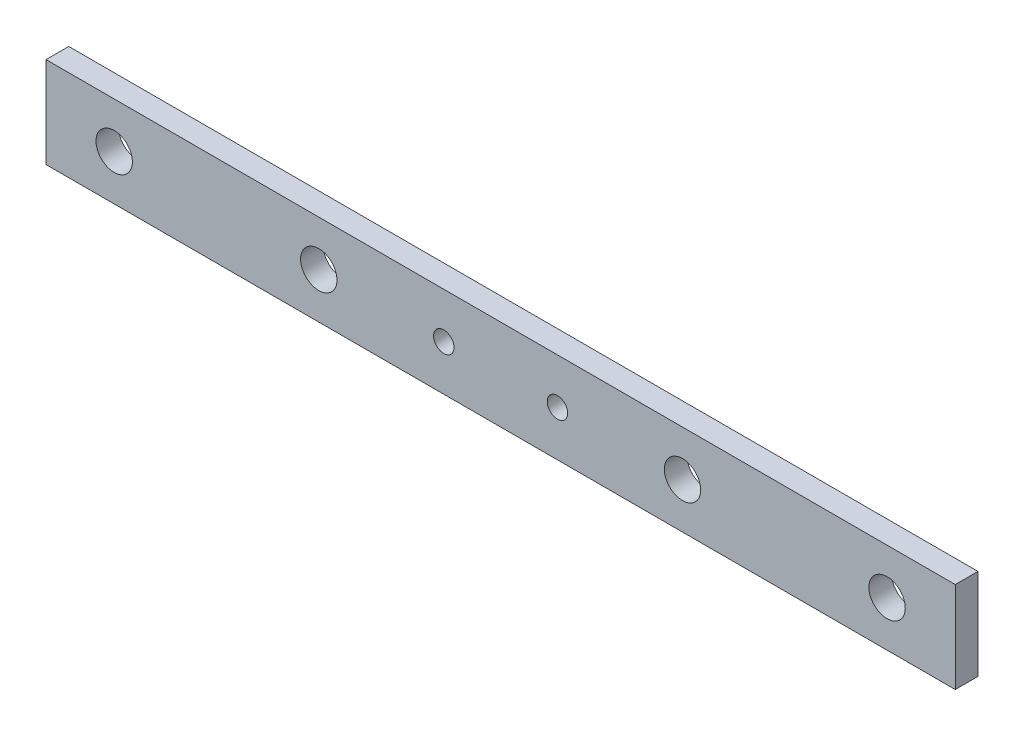
ISO-10303-21;
HEADER;
FILE_DESCRIPTION(('STEP AP214'),'2;1');
FILE_NAME('part.step','',(''),(''),'','','');
FILE_SCHEMA(('AUTOMOTIVE_DESIGN { 1 0 10303 214 1 1 1 1 }'));
ENDSEC;
DATA;
#1=APPLICATION_CONTEXT('core data for automotive mechanical design processes');
#2=APPLICATION_PROTOCOL_DEFINITION('international standard','automotive_design',2000,#1);
#3=PRODUCT_CONTEXT('',#1,'mechanical');
#4=PRODUCT('Part','Part','',(#3));
#5=PRODUCT_RELATED_PRODUCT_CATEGORY('part','',(#4));
#6=PRODUCT_DEFINITION_FORMATION('','',#4);
#7=PRODUCT_DEFINITION_CONTEXT('part definition',#1,'design');
#8=PRODUCT_DEFINITION('design','',#6,#7);
#9=PRODUCT_DEFINITION_SHAPE('','',#8);
#10=(LENGTH_UNIT() NAMED_UNIT(*) SI_UNIT(.MILLI.,.METRE.));
#11=(NAMED_UNIT(*) PLANE_ANGLE_UNIT() SI_UNIT($,.RADIAN.));
#12=(NAMED_UNIT(*) SI_UNIT($,.STERADIAN.) SOLID_ANGLE_UNIT());
#13=UNCERTAINTY_MEASURE_WITH_UNIT(LENGTH_MEASURE(1.E-05),#10,'distance_accuracy_value','');
#14=(GEOMETRIC_REPRESENTATION_CONTEXT(3) GLOBAL_UNCERTAINTY_ASSIGNED_CONTEXT((#13)) GLOBAL_UNIT_ASSIGNED_CONTEXT((#10,
#11,#12)) REPRESENTATION_CONTEXT('',''));
#15=CARTESIAN_POINT('',(0.,0.,0.));
#16=DIRECTION('',(0.,0.,1.));
#17=DIRECTION('',(1.,0.,0.));
#18=AXIS2_PLACEMENT_3D('',#15,#16,#17);
#19=CARTESIAN_POINT('',(0.,-10.,5.));
#20=DIRECTION('',(0.,1.,0.));
#21=DIRECTION('',(0.,0.,1.));
#22=AXIS2_PLACEMENT_3D('',#19,#20,#21);
#23=PLANE('',#22);
#24=DIRECTION('',(1.,0.,0.));
#25=VECTOR('',#24,1.);
#26=CARTESIAN_POINT('',(0.,-10.,0.));
#27=LINE('',#26,#25);
#28=CARTESIAN_POINT('',(-100.,-10.,0.));
#29=VERTEX_POINT('',#28);
#30=CARTESIAN_POINT('',(100.,-10.,0.));
#31=VERTEX_POINT('',#30);
#32=EDGE_CURVE('E146',#29,#31,#27,.T.);
#33=ORIENTED_EDGE('',*,*,#32,.T.);
#34=DIRECTION('',(0.,0.,-1.));
#35=VECTOR('',#34,1.);
#36=CARTESIAN_POINT('',(100.,-10.,5.));
#37=LINE('',#36,#35);
#38=CARTESIAN_POINT('',(100.,-10.,5.));
#39=VERTEX_POINT('',#38);
#40=EDGE_CURVE('E12',#39,#31,#37,.T.);
#41=ORIENTED_EDGE('',*,*,#40,.F.);
#42=DIRECTION('',(1.,0.,0.));
#43=VECTOR('',#42,1.);
#44=CARTESIAN_POINT('',(0.,-10.,5.));
#45=LINE('',#44,#43);
#46=CARTESIAN_POINT('',(-100.,-10.,5.));
#47=VERTEX_POINT('',#46);
#48=EDGE_CURVE('E94',#47,#39,#45,.T.);
#49=ORIENTED_EDGE('',*,*,#48,.F.);
#50=DIRECTION('',(0.,0.,-1.));
#51=VECTOR('',#50,1.);
#52=CARTESIAN_POINT('',(-100.,-10.,5.));
#53=LINE('',#52,#51);
#54=EDGE_CURVE('E60',#47,#29,#53,.T.);
#55=ORIENTED_EDGE('',*,*,#54,.T.);
#56=EDGE_LOOP('',(#33,#41,#49,#55));
#57=FACE_BOUND('',#56,.T.);
#58=ADVANCED_FACE('F42',(#57),#23,.F.);
#59=CARTESIAN_POINT('',(100.,0.,5.));
#60=DIRECTION('',(-1.,0.,0.));
#61=DIRECTION('',(0.,0.,1.));
#62=AXIS2_PLACEMENT_3D('',#59,#60,#61);
#63=PLANE('',#62);
#64=DIRECTION('',(0.,1.,0.));
#65=VECTOR('',#64,1.);
#66=CARTESIAN_POINT('',(100.,0.,0.));
#67=LINE('',#66,#65);
#68=CARTESIAN_POINT('',(100.,10.,0.));
#69=VERTEX_POINT('',#68);
#70=EDGE_CURVE('E100',#31,#69,#67,.T.);
#71=ORIENTED_EDGE('',*,*,#70,.T.);
#72=DIRECTION('',(0.,0.,-1.));
#73=VECTOR('',#72,1.);
#74=CARTESIAN_POINT('',(100.,10.,5.));
#75=LINE('',#74,#73);
#76=CARTESIAN_POINT('',(100.,10.,5.));
#77=VERTEX_POINT('',#76);
#78=EDGE_CURVE('E52',#77,#69,#75,.T.);
#79=ORIENTED_EDGE('',*,*,#78,.F.);
#80=DIRECTION('',(0.,1.,0.));
#81=VECTOR('',#80,1.);
#82=CARTESIAN_POINT('',(100.,0.,5.));
#83=LINE('',#82,#81);
#84=EDGE_CURVE('E85',#39,#77,#83,.T.);
#85=ORIENTED_EDGE('',*,*,#84,.F.);
#86=ORIENTED_EDGE('',*,*,#40,.T.);
#87=EDGE_LOOP('',(#71,#79,#85,#86));
#88=FACE_BOUND('',#87,.T.);
#89=ADVANCED_FACE('F99',(#88),#63,.F.);
#90=CARTESIAN_POINT('',(0.,10.,5.));
#91=DIRECTION('',(0.,1.,0.));
#92=DIRECTION('',(0.,0.,1.));
#93=AXIS2_PLACEMENT_3D('',#90,#91,#92);
#94=PLANE('',#93);
#95=DIRECTION('',(1.,0.,0.));
#96=VECTOR('',#95,1.);
#97=CARTESIAN_POINT('',(0.,10.,0.));
#98=LINE('',#97,#96);
#99=CARTESIAN_POINT('',(-100.,10.,0.));
#100=VERTEX_POINT('',#99);
#101=EDGE_CURVE('E151',#100,#69,#98,.T.);
#102=ORIENTED_EDGE('',*,*,#101,.F.);
#103=DIRECTION('',(0.,0.,-1.));
#104=VECTOR('',#103,1.);
#105=CARTESIAN_POINT('',(-100.,10.,5.));
#106=LINE('',#105,#104);
#107=CARTESIAN_POINT('',(-100.,10.,5.));
#108=VERTEX_POINT('',#107);
#109=EDGE_CURVE('E74',#108,#100,#106,.T.);
#110=ORIENTED_EDGE('',*,*,#109,.F.);
#111=DIRECTION('',(1.,0.,0.));
#112=VECTOR('',#111,1.);
#113=CARTESIAN_POINT('',(0.,10.,5.));
#114=LINE('',#113,#112);
#115=EDGE_CURVE('E93',#108,#77,#114,.T.);
#116=ORIENTED_EDGE('',*,*,#115,.T.);
#117=ORIENTED_EDGE('',*,*,#78,.T.);
#118=EDGE_LOOP('',(#102,#110,#116,#117));
#119=FACE_BOUND('',#118,.T.);
#120=ADVANCED_FACE('F104',(#119),#94,.T.);
#121=CARTESIAN_POINT('',(-12.5,0.,5.));
#122=DIRECTION('',(0.,0.,-1.));
#123=DIRECTION('',(-1.,0.,0.));
#124=AXIS2_PLACEMENT_3D('',#121,#122,#123);
#125=CYLINDRICAL_SURFACE('',#124,2.25);
#126=CARTESIAN_POINT('',(-12.5,0.,5.));
#127=DIRECTION('',(0.,0.,1.));
#128=DIRECTION('',(1.,0.,0.));
#129=AXIS2_PLACEMENT_3D('',#126,#127,#128);
#130=CIRCLE('',#129,2.25);
#131=CARTESIAN_POINT('',(-10.25,0.,5.));
#132=VERTEX_POINT('',#131);
#133=EDGE_CURVE('E133',#132,#132,#130,.T.);
#134=ORIENTED_EDGE('',*,*,#133,.T.);
#135=EDGE_LOOP('',(#134));
#136=FACE_BOUND('',#135,.T.);
#137=CARTESIAN_POINT('',(-12.5,0.,0.));
#138=DIRECTION('',(0.,0.,1.));
#139=DIRECTION('',(1.,0.,0.));
#140=AXIS2_PLACEMENT_3D('',#137,#138,#139);
#141=CIRCLE('',#140,2.25);
#142=CARTESIAN_POINT('',(-10.25,0.,0.));
#143=VERTEX_POINT('',#142);
#144=EDGE_CURVE('E170',#143,#143,#141,.T.);
#145=ORIENTED_EDGE('',*,*,#144,.F.);
#146=EDGE_LOOP('',(#145));
#147=FACE_BOUND('',#146,.T.);
#148=ADVANCED_FACE('F212',(#136,#147),#125,.F.);
#149=CARTESIAN_POINT('',(40.,0.,5.));
#150=DIRECTION('',(0.,0.,-1.));
#151=DIRECTION('',(-1.,0.,0.));
#152=AXIS2_PLACEMENT_3D('',#149,#150,#151);
#153=CYLINDRICAL_SURFACE('',#152,4.);
#154=CARTESIAN_POINT('',(40.,0.,5.));
#155=DIRECTION('',(0.,0.,1.));
#156=DIRECTION('',(1.,0.,0.));
#157=AXIS2_PLACEMENT_3D('',#154,#155,#156);
#158=CIRCLE('',#157,4.);
#159=CARTESIAN_POINT('',(44.,0.,5.));
#160=VERTEX_POINT('',#159);
#161=EDGE_CURVE('E130',#160,#160,#158,.F.);
#162=ORIENTED_EDGE('',*,*,#161,.F.);
#163=EDGE_LOOP('',(#162));
#164=FACE_BOUND('',#163,.T.);
#165=CARTESIAN_POINT('',(40.,0.,0.));
#166=DIRECTION('',(0.,0.,1.));
#167=DIRECTION('',(1.,0.,0.));
#168=AXIS2_PLACEMENT_3D('',#165,#166,#167);
#169=CIRCLE('',#168,4.);
#170=CARTESIAN_POINT('',(44.,0.,0.));
#171=VERTEX_POINT('',#170);
#172=EDGE_CURVE('E166',#171,#171,#169,.F.);
#173=ORIENTED_EDGE('',*,*,#172,.T.);
#174=EDGE_LOOP('',(#173));
#175=FACE_BOUND('',#174,.T.);
#176=ADVANCED_FACE('F214',(#164,#175),#153,.F.);
#177=CARTESIAN_POINT('',(-40.,0.,5.));
#178=DIRECTION('',(0.,0.,-1.));
#179=DIRECTION('',(-1.,0.,0.));
#180=AXIS2_PLACEMENT_3D('',#177,#178,#179);
#181=CYLINDRICAL_SURFACE('',#180,4.);
#182=CARTESIAN_POINT('',(-40.,0.,5.));
#183=DIRECTION('',(0.,0.,1.));
#184=DIRECTION('',(1.,0.,0.));
#185=AXIS2_PLACEMENT_3D('',#182,#183,#184);
#186=CIRCLE('',#185,4.);
#187=CARTESIAN_POINT('',(-36.,0.,5.));
#188=VERTEX_POINT('',#187);
#189=EDGE_CURVE('E125',#188,#188,#186,.T.);
#190=ORIENTED_EDGE('',*,*,#189,.T.);
#191=EDGE_LOOP('',(#190));
#192=FACE_BOUND('',#191,.T.);
#193=CARTESIAN_POINT('',(-40.,0.,0.));
#194=DIRECTION('',(0.,0.,1.));
#195=DIRECTION('',(1.,0.,0.));
#196=AXIS2_PLACEMENT_3D('',#193,#194,#195);
#197=CIRCLE('',#196,4.);
#198=CARTESIAN_POINT('',(-36.,0.,0.));
#199=VERTEX_POINT('',#198);
#200=EDGE_CURVE('E162',#199,#199,#197,.T.);
#201=ORIENTED_EDGE('',*,*,#200,.F.);
#202=EDGE_LOOP('',(#201));
#203=FACE_BOUND('',#202,.T.);
#204=ADVANCED_FACE('F221',(#192,#203),#181,.F.);
#205=CARTESIAN_POINT('',(-85.,0.,5.));
#206=DIRECTION('',(0.,0.,-1.));
#207=DIRECTION('',(-1.,0.,0.));
#208=AXIS2_PLACEMENT_3D('',#205,#206,#207);
#209=CYLINDRICAL_SURFACE('',#208,4.00000000000001);
#210=CARTESIAN_POINT('',(-85.,0.,5.));
#211=DIRECTION('',(0.,0.,1.));
#212=DIRECTION('',(1.,0.,0.));
#213=AXIS2_PLACEMENT_3D('',#210,#211,#212);
#214=CIRCLE('',#213,4.00000000000001);
#215=CARTESIAN_POINT('',(-81.,0.,5.));
#216=VERTEX_POINT('',#215);
#217=EDGE_CURVE('E109',#216,#216,#214,.T.);
#218=ORIENTED_EDGE('',*,*,#217,.T.);
#219=EDGE_LOOP('',(#218));
#220=FACE_BOUND('',#219,.T.);
#221=CARTESIAN_POINT('',(-85.,0.,0.));
#222=DIRECTION('',(0.,0.,1.));
#223=DIRECTION('',(1.,0.,0.));
#224=AXIS2_PLACEMENT_3D('',#221,#222,#223);
#225=CIRCLE('',#224,4.00000000000001);
#226=CARTESIAN_POINT('',(-81.,0.,0.));
#227=VERTEX_POINT('',#226);
#228=EDGE_CURVE('E158',#227,#227,#225,.T.);
#229=ORIENTED_EDGE('',*,*,#228,.F.);
#230=EDGE_LOOP('',(#229));
#231=FACE_BOUND('',#230,.T.);
#232=ADVANCED_FACE('F234',(#220,#231),#209,.F.);
#233=CARTESIAN_POINT('',(-100.,0.,5.));
#234=DIRECTION('',(-1.,0.,0.));
#235=DIRECTION('',(0.,0.,1.));
#236=AXIS2_PLACEMENT_3D('',#233,#234,#235);
#237=PLANE('',#236);
#238=DIRECTION('',(0.,1.,0.));
#239=VECTOR('',#238,1.);
#240=CARTESIAN_POINT('',(-100.,0.,0.));
#241=LINE('',#240,#239);
#242=EDGE_CURVE('E154',#29,#100,#241,.T.);
#243=ORIENTED_EDGE('',*,*,#242,.F.);
#244=ORIENTED_EDGE('',*,*,#54,.F.);
#245=DIRECTION('',(0.,1.,0.));
#246=VECTOR('',#245,1.);
#247=CARTESIAN_POINT('',(-100.,0.,5.));
#248=LINE('',#247,#246);
#249=EDGE_CURVE('E106',#47,#108,#248,.T.);
#250=ORIENTED_EDGE('',*,*,#249,.T.);
#251=ORIENTED_EDGE('',*,*,#109,.T.);
#252=EDGE_LOOP('',(#243,#244,#250,#251));
#253=FACE_BOUND('',#252,.T.);
#254=ADVANCED_FACE('F195',(#253),#237,.T.);
#255=CARTESIAN_POINT('',(85.,0.,5.));
#256=DIRECTION('',(0.,0.,-1.));
#257=DIRECTION('',(-1.,0.,0.));
#258=AXIS2_PLACEMENT_3D('',#255,#256,#257);
#259=CYLINDRICAL_SURFACE('',#258,4.00000000000001);
#260=CARTESIAN_POINT('',(85.,0.,5.));
#261=DIRECTION('',(0.,0.,1.));
#262=DIRECTION('',(1.,0.,0.));
#263=AXIS2_PLACEMENT_3D('',#260,#261,#262);
#264=CIRCLE('',#263,4.00000000000001);
#265=CARTESIAN_POINT('',(89.,0.,5.));
#266=VERTEX_POINT('',#265);
#267=EDGE_CURVE('E178',#266,#266,#264,.F.);
#268=ORIENTED_EDGE('',*,*,#267,.F.);
#269=EDGE_LOOP('',(#268));
#270=FACE_BOUND('',#269,.T.);
#271=CARTESIAN_POINT('',(85.,0.,0.));
#272=DIRECTION('',(0.,0.,1.));
#273=DIRECTION('',(1.,0.,0.));
#274=AXIS2_PLACEMENT_3D('',#271,#272,#273);
#275=CIRCLE('',#274,4.00000000000001);
#276=CARTESIAN_POINT('',(89.,0.,0.));
#277=VERTEX_POINT('',#276);
#278=EDGE_CURVE('E142',#277,#277,#275,.F.);
#279=ORIENTED_EDGE('',*,*,#278,.T.);
#280=EDGE_LOOP('',(#279));
#281=FACE_BOUND('',#280,.T.);
#282=ADVANCED_FACE('F44',(#270,#281),#259,.F.);
#283=CARTESIAN_POINT('',(12.5,0.,5.));
#284=DIRECTION('',(0.,0.,-1.));
#285=DIRECTION('',(-1.,0.,0.));
#286=AXIS2_PLACEMENT_3D('',#283,#284,#285);
#287=CYLINDRICAL_SURFACE('',#286,2.25);
#288=CARTESIAN_POINT('',(12.5,0.,5.));
#289=DIRECTION('',(0.,0.,1.));
#290=DIRECTION('',(1.,0.,0.));
#291=AXIS2_PLACEMENT_3D('',#288,#289,#290);
#292=CIRCLE('',#291,2.25);
#293=CARTESIAN_POINT('',(14.75,0.,5.));
#294=VERTEX_POINT('',#293);
#295=EDGE_CURVE('E138',#294,#294,#292,.F.);
#296=ORIENTED_EDGE('',*,*,#295,.F.);
#297=EDGE_LOOP('',(#296));
#298=FACE_BOUND('',#297,.T.);
#299=CARTESIAN_POINT('',(12.5,0.,0.));
#300=DIRECTION('',(0.,0.,1.));
#301=DIRECTION('',(1.,0.,0.));
#302=AXIS2_PLACEMENT_3D('',#299,#300,#301);
#303=CIRCLE('',#302,2.25);
#304=CARTESIAN_POINT('',(14.75,0.,0.));
#305=VERTEX_POINT('',#304);
#306=EDGE_CURVE('E174',#305,#305,#303,.F.);
#307=ORIENTED_EDGE('',*,*,#306,.T.);
#308=EDGE_LOOP('',(#307));
#309=FACE_BOUND('',#308,.T.);
#310=ADVANCED_FACE('F194',(#298,#309),#287,.F.);
#311=CARTESIAN_POINT('',(0.,0.,5.));
#312=DIRECTION('',(0.,0.,1.));
#313=DIRECTION('',(1.,0.,0.));
#314=AXIS2_PLACEMENT_3D('',#311,#312,#313);
#315=PLANE('',#314);
#316=ORIENTED_EDGE('',*,*,#267,.T.);
#317=EDGE_LOOP('',(#316));
#318=FACE_BOUND('',#317,.T.);
#319=ORIENTED_EDGE('',*,*,#48,.T.);
#320=ORIENTED_EDGE('',*,*,#84,.T.);
#321=ORIENTED_EDGE('',*,*,#115,.F.);
#322=ORIENTED_EDGE('',*,*,#249,.F.);
#323=EDGE_LOOP('',(#319,#320,#321,#322));
#324=FACE_BOUND('',#323,.T.);
#325=ORIENTED_EDGE('',*,*,#217,.F.);
#326=EDGE_LOOP('',(#325));
#327=FACE_BOUND('',#326,.T.);
#328=ORIENTED_EDGE('',*,*,#189,.F.);
#329=EDGE_LOOP('',(#328));
#330=FACE_BOUND('',#329,.T.);
#331=ORIENTED_EDGE('',*,*,#161,.T.);
#332=EDGE_LOOP('',(#331));
#333=FACE_BOUND('',#332,.T.);
#334=ORIENTED_EDGE('',*,*,#133,.F.);
#335=EDGE_LOOP('',(#334));
#336=FACE_BOUND('',#335,.T.);
#337=ORIENTED_EDGE('',*,*,#295,.T.);
#338=EDGE_LOOP('',(#337));
#339=FACE_BOUND('',#338,.T.);
#340=ADVANCED_FACE('F89',(#318,#324,#327,#330,#333,#336,#339),#315,.T.);
#341=CARTESIAN_POINT('',(0.,0.,0.));
#342=DIRECTION('',(0.,0.,1.));
#343=DIRECTION('',(1.,0.,0.));
#344=AXIS2_PLACEMENT_3D('',#341,#342,#343);
#345=PLANE('',#344);
#346=ORIENTED_EDGE('',*,*,#278,.F.);
#347=EDGE_LOOP('',(#346));
#348=FACE_BOUND('',#347,.T.);
#349=ORIENTED_EDGE('',*,*,#32,.F.);
#350=ORIENTED_EDGE('',*,*,#242,.T.);
#351=ORIENTED_EDGE('',*,*,#101,.T.);
#352=ORIENTED_EDGE('',*,*,#70,.F.);
#353=EDGE_LOOP('',(#349,#350,#351,#352));
#354=FACE_BOUND('',#353,.T.);
#355=ORIENTED_EDGE('',*,*,#228,.T.);
#356=EDGE_LOOP('',(#355));
#357=FACE_BOUND('',#356,.T.);
#358=ORIENTED_EDGE('',*,*,#200,.T.);
#359=EDGE_LOOP('',(#358));
#360=FACE_BOUND('',#359,.T.);
#361=ORIENTED_EDGE('',*,*,#172,.F.);
#362=EDGE_LOOP('',(#361));
#363=FACE_BOUND('',#362,.T.);
#364=ORIENTED_EDGE('',*,*,#144,.T.);
#365=EDGE_LOOP('',(#364));
#366=FACE_BOUND('',#365,.T.);
#367=ORIENTED_EDGE('',*,*,#306,.F.);
#368=EDGE_LOOP('',(#367));
#369=FACE_BOUND('',#368,.T.);
#370=ADVANCED_FACE('F198',(#348,#354,#357,#360,#363,#366,#369),#345,.F.);
#371=CLOSED_SHELL('',(#58,#89,#120,#148,#176,#204,#232,#254,#282,#310,#340,#370));
#372=MANIFOLD_SOLID_BREP('B2',#371);
#373=ADVANCED_BREP_SHAPE_REPRESENTATION('',(#18,#372),#14);
#374=SHAPE_DEFINITION_REPRESENTATION(#9,#373);
ENDSEC;
END-ISO-10303-21;
